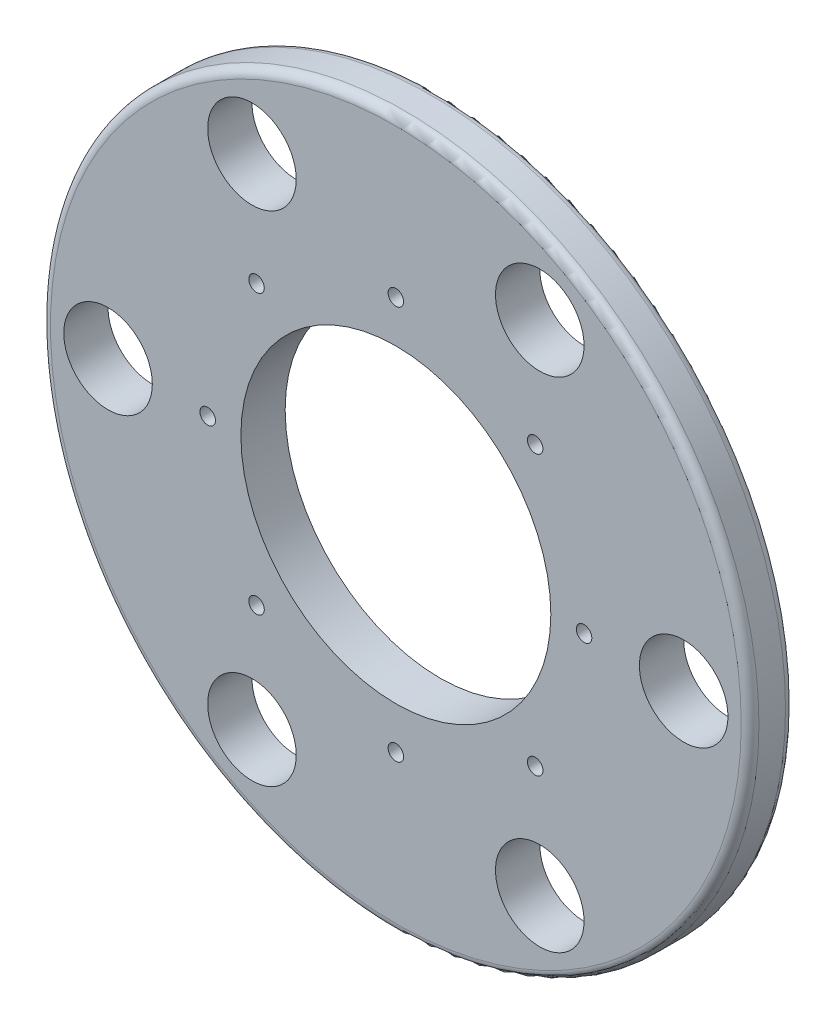
ISO-10303-21;
HEADER;
FILE_DESCRIPTION(('STEP AP214'),'2;1');
FILE_NAME('part.step','',(''),(''),'','','');
FILE_SCHEMA(('AUTOMOTIVE_DESIGN { 1 0 10303 214 1 1 1 1 }'));
ENDSEC;
DATA;
#1=APPLICATION_CONTEXT('core data for automotive mechanical design processes');
#2=APPLICATION_PROTOCOL_DEFINITION('international standard','automotive_design',2000,#1);
#3=PRODUCT_CONTEXT('',#1,'mechanical');
#4=PRODUCT('Part','Part','',(#3));
#5=PRODUCT_RELATED_PRODUCT_CATEGORY('part','',(#4));
#6=PRODUCT_DEFINITION_FORMATION('','',#4);
#7=PRODUCT_DEFINITION_CONTEXT('part definition',#1,'design');
#8=PRODUCT_DEFINITION('design','',#6,#7);
#9=PRODUCT_DEFINITION_SHAPE('','',#8);
#10=(LENGTH_UNIT() NAMED_UNIT(*) SI_UNIT(.MILLI.,.METRE.));
#11=(NAMED_UNIT(*) PLANE_ANGLE_UNIT() SI_UNIT($,.RADIAN.));
#12=(NAMED_UNIT(*) SI_UNIT($,.STERADIAN.) SOLID_ANGLE_UNIT());
#13=UNCERTAINTY_MEASURE_WITH_UNIT(LENGTH_MEASURE(1.E-05),#10,'distance_accuracy_value','');
#14=(GEOMETRIC_REPRESENTATION_CONTEXT(3) GLOBAL_UNCERTAINTY_ASSIGNED_CONTEXT((#13)) GLOBAL_UNIT_ASSIGNED_CONTEXT((#10,
#11,#12)) REPRESENTATION_CONTEXT('',''));
#15=CARTESIAN_POINT('',(0.,0.,0.));
#16=DIRECTION('',(0.,0.,1.));
#17=DIRECTION('',(1.,0.,0.));
#18=AXIS2_PLACEMENT_3D('',#15,#16,#17);
#19=CARTESIAN_POINT('',(0.,0.,-10.));
#20=DIRECTION('',(0.,0.,1.));
#21=DIRECTION('',(1.,0.,0.));
#22=AXIS2_PLACEMENT_3D('',#19,#20,#21);
#23=CYLINDRICAL_SURFACE('',#22,80.);
#24=CARTESIAN_POINT('',(0.,0.,-8.));
#25=DIRECTION('',(0.,0.,1.));
#26=DIRECTION('',(1.,0.,0.));
#27=AXIS2_PLACEMENT_3D('',#24,#25,#26);
#28=CIRCLE('',#27,80.);
#29=CARTESIAN_POINT('',(80.,0.,-8.));
#30=VERTEX_POINT('',#29);
#31=EDGE_CURVE('E53',#30,#30,#28,.T.);
#32=ORIENTED_EDGE('',*,*,#31,.T.);
#33=EDGE_LOOP('',(#32));
#34=FACE_BOUND('',#33,.T.);
#35=CARTESIAN_POINT('',(0.,0.,-2.));
#36=DIRECTION('',(0.,0.,1.));
#37=DIRECTION('',(1.,0.,0.));
#38=AXIS2_PLACEMENT_3D('',#35,#36,#37);
#39=CIRCLE('',#38,80.);
#40=CARTESIAN_POINT('',(80.,0.,-2.));
#41=VERTEX_POINT('',#40);
#42=EDGE_CURVE('E58',#41,#41,#39,.F.);
#43=ORIENTED_EDGE('',*,*,#42,.T.);
#44=EDGE_LOOP('',(#43));
#45=FACE_BOUND('',#44,.T.);
#46=ADVANCED_FACE('F40',(#34,#45),#23,.T.);
#47=CARTESIAN_POINT('',(0.,0.,-10.));
#48=DIRECTION('',(0.,0.,1.));
#49=DIRECTION('',(1.,0.,0.));
#50=AXIS2_PLACEMENT_3D('',#47,#48,#49);
#51=PLANE('',#50);
#52=CARTESIAN_POINT('',(0.,0.,-10.));
#53=DIRECTION('',(0.,0.,1.));
#54=DIRECTION('',(1.,0.,0.));
#55=AXIS2_PLACEMENT_3D('',#52,#53,#54);
#56=CIRCLE('',#55,78.);
#57=CARTESIAN_POINT('',(78.,0.,-10.));
#58=VERTEX_POINT('',#57);
#59=EDGE_CURVE('E48',#58,#58,#56,.F.);
#60=ORIENTED_EDGE('',*,*,#59,.T.);
#61=EDGE_LOOP('',(#60));
#62=FACE_BOUND('',#61,.T.);
#63=CARTESIAN_POINT('',(0.,0.,-10.));
#64=DIRECTION('',(0.,0.,1.));
#65=DIRECTION('',(1.,0.,0.));
#66=AXIS2_PLACEMENT_3D('',#63,#64,#65);
#67=CIRCLE('',#66,35.);
#68=CARTESIAN_POINT('',(35.,0.,-10.));
#69=VERTEX_POINT('',#68);
#70=EDGE_CURVE('E156',#69,#69,#67,.T.);
#71=ORIENTED_EDGE('',*,*,#70,.T.);
#72=EDGE_LOOP('',(#71));
#73=FACE_BOUND('',#72,.T.);
#74=CARTESIAN_POINT('',(1.55370919578519E-13,44.5,-10.));
#75=DIRECTION('',(0.,0.,1.));
#76=DIRECTION('',(1.,0.,0.));
#77=AXIS2_PLACEMENT_3D('',#74,#75,#76);
#78=CIRCLE('',#77,1.75);
#79=CARTESIAN_POINT('',(1.75000000000016,44.5,-10.));
#80=VERTEX_POINT('',#79);
#81=EDGE_CURVE('E82',#80,#80,#78,.T.);
#82=ORIENTED_EDGE('',*,*,#81,.T.);
#83=EDGE_LOOP('',(#82));
#84=FACE_BOUND('',#83,.T.);
#85=CARTESIAN_POINT('',(-4.66112758735558E-13,-44.5,-10.));
#86=DIRECTION('',(0.,0.,1.));
#87=DIRECTION('',(1.,0.,0.));
#88=AXIS2_PLACEMENT_3D('',#85,#86,#87);
#89=CIRCLE('',#88,1.75000000000001);
#90=CARTESIAN_POINT('',(1.74999999999954,-44.5,-10.));
#91=VERTEX_POINT('',#90);
#92=EDGE_CURVE('E151',#91,#91,#89,.T.);
#93=ORIENTED_EDGE('',*,*,#92,.T.);
#94=EDGE_LOOP('',(#93));
#95=FACE_BOUND('',#94,.T.);
#96=CARTESIAN_POINT('',(-31.4662517628013,31.4662517628014,-10.));
#97=DIRECTION('',(0.,0.,1.));
#98=DIRECTION('',(1.,0.,0.));
#99=AXIS2_PLACEMENT_3D('',#96,#97,#98);
#100=CIRCLE('',#99,1.75);
#101=CARTESIAN_POINT('',(-29.7162517628013,31.4662517628014,-10.));
#102=VERTEX_POINT('',#101);
#103=EDGE_CURVE('E160',#102,#102,#100,.T.);
#104=ORIENTED_EDGE('',*,*,#103,.T.);
#105=EDGE_LOOP('',(#104));
#106=FACE_BOUND('',#105,.T.);
#107=CARTESIAN_POINT('',(-42.5,0.,-10.));
#108=DIRECTION('',(0.,0.,1.));
#109=DIRECTION('',(1.,0.,0.));
#110=AXIS2_PLACEMENT_3D('',#107,#108,#109);
#111=CIRCLE('',#110,1.75);
#112=CARTESIAN_POINT('',(-40.75,0.,-10.));
#113=VERTEX_POINT('',#112);
#114=EDGE_CURVE('E168',#113,#113,#111,.T.);
#115=ORIENTED_EDGE('',*,*,#114,.T.);
#116=EDGE_LOOP('',(#115));
#117=FACE_BOUND('',#116,.T.);
#118=CARTESIAN_POINT('',(-31.4662517628018,-31.466251762801,-10.));
#119=DIRECTION('',(0.,0.,1.));
#120=DIRECTION('',(1.,0.,0.));
#121=AXIS2_PLACEMENT_3D('',#118,#119,#120);
#122=CIRCLE('',#121,1.75);
#123=CARTESIAN_POINT('',(-29.7162517628018,-31.466251762801,-10.));
#124=VERTEX_POINT('',#123);
#125=EDGE_CURVE('E117',#124,#124,#122,.T.);
#126=ORIENTED_EDGE('',*,*,#125,.T.);
#127=EDGE_LOOP('',(#126));
#128=FACE_BOUND('',#127,.T.);
#129=CARTESIAN_POINT('',(31.4662517628011,-31.4662517628016,-10.));
#130=DIRECTION('',(0.,0.,1.));
#131=DIRECTION('',(1.,0.,0.));
#132=AXIS2_PLACEMENT_3D('',#129,#130,#131);
#133=CIRCLE('',#132,1.75);
#134=CARTESIAN_POINT('',(33.2162517628011,-31.4662517628016,-10.));
#135=VERTEX_POINT('',#134);
#136=EDGE_CURVE('E126',#135,#135,#133,.T.);
#137=ORIENTED_EDGE('',*,*,#136,.T.);
#138=EDGE_LOOP('',(#137));
#139=FACE_BOUND('',#138,.T.);
#140=CARTESIAN_POINT('',(42.5,-2.9157116490529E-13,-10.));
#141=DIRECTION('',(0.,0.,1.));
#142=DIRECTION('',(1.,0.,0.));
#143=AXIS2_PLACEMENT_3D('',#140,#141,#142);
#144=CIRCLE('',#143,1.75);
#145=CARTESIAN_POINT('',(44.25,-2.9157116490529E-13,-10.));
#146=VERTEX_POINT('',#145);
#147=EDGE_CURVE('E134',#146,#146,#144,.T.);
#148=ORIENTED_EDGE('',*,*,#147,.T.);
#149=EDGE_LOOP('',(#148));
#150=FACE_BOUND('',#149,.T.);
#151=CARTESIAN_POINT('',(31.4662517628015,31.4662517628012,-10.));
#152=DIRECTION('',(0.,0.,1.));
#153=DIRECTION('',(1.,0.,0.));
#154=AXIS2_PLACEMENT_3D('',#151,#152,#153);
#155=CIRCLE('',#154,1.75);
#156=CARTESIAN_POINT('',(33.2162517628015,31.4662517628012,-10.));
#157=VERTEX_POINT('',#156);
#158=EDGE_CURVE('E142',#157,#157,#155,.T.);
#159=ORIENTED_EDGE('',*,*,#158,.T.);
#160=EDGE_LOOP('',(#159));
#161=FACE_BOUND('',#160,.T.);
#162=CARTESIAN_POINT('',(32.5000000000003,56.2916512459884,-10.));
#163=DIRECTION('',(0.,0.,1.));
#164=DIRECTION('',(1.,0.,0.));
#165=AXIS2_PLACEMENT_3D('',#162,#163,#164);
#166=CIRCLE('',#165,10.);
#167=CARTESIAN_POINT('',(42.5000000000003,56.2916512459884,-10.));
#168=VERTEX_POINT('',#167);
#169=EDGE_CURVE('E81',#168,#168,#166,.T.);
#170=ORIENTED_EDGE('',*,*,#169,.T.);
#171=EDGE_LOOP('',(#170));
#172=FACE_BOUND('',#171,.T.);
#173=CARTESIAN_POINT('',(65.,-4.45932369855149E-13,-10.));
#174=DIRECTION('',(0.,0.,1.));
#175=DIRECTION('',(1.,0.,0.));
#176=AXIS2_PLACEMENT_3D('',#173,#174,#175);
#177=CIRCLE('',#176,10.);
#178=CARTESIAN_POINT('',(75.,-4.45932369855149E-13,-10.));
#179=VERTEX_POINT('',#178);
#180=EDGE_CURVE('E90',#179,#179,#177,.T.);
#181=ORIENTED_EDGE('',*,*,#180,.T.);
#182=EDGE_LOOP('',(#181));
#183=FACE_BOUND('',#182,.T.);
#184=CARTESIAN_POINT('',(32.4999999999995,-56.2916512459888,-10.));
#185=DIRECTION('',(0.,0.,1.));
#186=DIRECTION('',(1.,0.,0.));
#187=AXIS2_PLACEMENT_3D('',#184,#185,#186);
#188=CIRCLE('',#187,10.);
#189=CARTESIAN_POINT('',(42.4999999999995,-56.2916512459888,-10.));
#190=VERTEX_POINT('',#189);
#191=EDGE_CURVE('E98',#190,#190,#188,.T.);
#192=ORIENTED_EDGE('',*,*,#191,.T.);
#193=EDGE_LOOP('',(#192));
#194=FACE_BOUND('',#193,.T.);
#195=CARTESIAN_POINT('',(-32.5000000000007,-56.2916512459882,-10.));
#196=DIRECTION('',(0.,0.,1.));
#197=DIRECTION('',(1.,0.,0.));
#198=AXIS2_PLACEMENT_3D('',#195,#196,#197);
#199=CIRCLE('',#198,10.);
#200=CARTESIAN_POINT('',(-22.5000000000006,-56.2916512459882,-10.));
#201=VERTEX_POINT('',#200);
#202=EDGE_CURVE('E106',#201,#201,#199,.T.);
#203=ORIENTED_EDGE('',*,*,#202,.T.);
#204=EDGE_LOOP('',(#203));
#205=FACE_BOUND('',#204,.T.);
#206=CARTESIAN_POINT('',(-65.,0.,-10.));
#207=DIRECTION('',(0.,0.,1.));
#208=DIRECTION('',(1.,0.,0.));
#209=AXIS2_PLACEMENT_3D('',#206,#207,#208);
#210=CIRCLE('',#209,10.);
#211=CARTESIAN_POINT('',(-55.,0.,-10.));
#212=VERTEX_POINT('',#211);
#213=EDGE_CURVE('E73',#212,#212,#210,.T.);
#214=ORIENTED_EDGE('',*,*,#213,.T.);
#215=EDGE_LOOP('',(#214));
#216=FACE_BOUND('',#215,.T.);
#217=CARTESIAN_POINT('',(-32.4999999999999,56.2916512459886,-10.));
#218=DIRECTION('',(0.,0.,1.));
#219=DIRECTION('',(1.,0.,0.));
#220=AXIS2_PLACEMENT_3D('',#217,#218,#219);
#221=CIRCLE('',#220,10.);
#222=CARTESIAN_POINT('',(-22.4999999999999,56.2916512459886,-10.));
#223=VERTEX_POINT('',#222);
#224=EDGE_CURVE('E68',#223,#223,#221,.T.);
#225=ORIENTED_EDGE('',*,*,#224,.T.);
#226=EDGE_LOOP('',(#225));
#227=FACE_BOUND('',#226,.T.);
#228=ADVANCED_FACE('F185',(#62,#73,#84,#95,#106,#117,#128,#139,#150,#161,#172,#183,#194,#205,
#216,#227),#51,.F.);
#229=CARTESIAN_POINT('',(0.,0.,0.));
#230=DIRECTION('',(0.,0.,1.));
#231=DIRECTION('',(1.,0.,0.));
#232=AXIS2_PLACEMENT_3D('',#229,#230,#231);
#233=PLANE('',#232);
#234=CARTESIAN_POINT('',(0.,0.,0.));
#235=DIRECTION('',(0.,0.,1.));
#236=DIRECTION('',(1.,0.,0.));
#237=AXIS2_PLACEMENT_3D('',#234,#235,#236);
#238=CIRCLE('',#237,78.);
#239=CARTESIAN_POINT('',(78.,0.,0.));
#240=VERTEX_POINT('',#239);
#241=EDGE_CURVE('E10',#240,#240,#238,.T.);
#242=ORIENTED_EDGE('',*,*,#241,.T.);
#243=EDGE_LOOP('',(#242));
#244=FACE_BOUND('',#243,.T.);
#245=CARTESIAN_POINT('',(1.55370919578519E-13,44.5,0.));
#246=DIRECTION('',(0.,0.,1.));
#247=DIRECTION('',(1.,0.,0.));
#248=AXIS2_PLACEMENT_3D('',#245,#246,#247);
#249=CIRCLE('',#248,1.75);
#250=CARTESIAN_POINT('',(1.75000000000016,44.5,0.));
#251=VERTEX_POINT('',#250);
#252=EDGE_CURVE('E150',#251,#251,#249,.T.);
#253=ORIENTED_EDGE('',*,*,#252,.F.);
#254=EDGE_LOOP('',(#253));
#255=FACE_BOUND('',#254,.T.);
#256=CARTESIAN_POINT('',(-4.66112758735558E-13,-44.5,0.));
#257=DIRECTION('',(0.,0.,1.));
#258=DIRECTION('',(1.,0.,0.));
#259=AXIS2_PLACEMENT_3D('',#256,#257,#258);
#260=CIRCLE('',#259,1.75000000000001);
#261=CARTESIAN_POINT('',(1.74999999999954,-44.5,0.));
#262=VERTEX_POINT('',#261);
#263=EDGE_CURVE('E155',#262,#262,#260,.T.);
#264=ORIENTED_EDGE('',*,*,#263,.F.);
#265=EDGE_LOOP('',(#264));
#266=FACE_BOUND('',#265,.T.);
#267=CARTESIAN_POINT('',(-31.4662517628013,31.4662517628014,0.));
#268=DIRECTION('',(0.,0.,1.));
#269=DIRECTION('',(1.,0.,0.));
#270=AXIS2_PLACEMENT_3D('',#267,#268,#269);
#271=CIRCLE('',#270,1.75);
#272=CARTESIAN_POINT('',(-29.7162517628013,31.4662517628014,0.));
#273=VERTEX_POINT('',#272);
#274=EDGE_CURVE('E164',#273,#273,#271,.T.);
#275=ORIENTED_EDGE('',*,*,#274,.F.);
#276=EDGE_LOOP('',(#275));
#277=FACE_BOUND('',#276,.T.);
#278=CARTESIAN_POINT('',(-42.5,0.,0.));
#279=DIRECTION('',(0.,0.,1.));
#280=DIRECTION('',(1.,0.,0.));
#281=AXIS2_PLACEMENT_3D('',#278,#279,#280);
#282=CIRCLE('',#281,1.75);
#283=CARTESIAN_POINT('',(-40.75,0.,0.));
#284=VERTEX_POINT('',#283);
#285=EDGE_CURVE('E122',#284,#284,#282,.T.);
#286=ORIENTED_EDGE('',*,*,#285,.F.);
#287=EDGE_LOOP('',(#286));
#288=FACE_BOUND('',#287,.T.);
#289=CARTESIAN_POINT('',(-31.4662517628018,-31.466251762801,0.));
#290=DIRECTION('',(0.,0.,1.));
#291=DIRECTION('',(1.,0.,0.));
#292=AXIS2_PLACEMENT_3D('',#289,#290,#291);
#293=CIRCLE('',#292,1.75);
#294=CARTESIAN_POINT('',(-29.7162517628018,-31.466251762801,0.));
#295=VERTEX_POINT('',#294);
#296=EDGE_CURVE('E121',#295,#295,#293,.T.);
#297=ORIENTED_EDGE('',*,*,#296,.F.);
#298=EDGE_LOOP('',(#297));
#299=FACE_BOUND('',#298,.T.);
#300=CARTESIAN_POINT('',(31.4662517628011,-31.4662517628016,0.));
#301=DIRECTION('',(0.,0.,1.));
#302=DIRECTION('',(1.,0.,0.));
#303=AXIS2_PLACEMENT_3D('',#300,#301,#302);
#304=CIRCLE('',#303,1.75);
#305=CARTESIAN_POINT('',(33.2162517628011,-31.4662517628016,0.));
#306=VERTEX_POINT('',#305);
#307=EDGE_CURVE('E130',#306,#306,#304,.T.);
#308=ORIENTED_EDGE('',*,*,#307,.F.);
#309=EDGE_LOOP('',(#308));
#310=FACE_BOUND('',#309,.T.);
#311=CARTESIAN_POINT('',(42.5,-2.9157116490529E-13,0.));
#312=DIRECTION('',(0.,0.,1.));
#313=DIRECTION('',(1.,0.,0.));
#314=AXIS2_PLACEMENT_3D('',#311,#312,#313);
#315=CIRCLE('',#314,1.75);
#316=CARTESIAN_POINT('',(44.25,-2.9157116490529E-13,0.));
#317=VERTEX_POINT('',#316);
#318=EDGE_CURVE('E138',#317,#317,#315,.T.);
#319=ORIENTED_EDGE('',*,*,#318,.F.);
#320=EDGE_LOOP('',(#319));
#321=FACE_BOUND('',#320,.T.);
#322=CARTESIAN_POINT('',(31.4662517628015,31.4662517628012,0.));
#323=DIRECTION('',(0.,0.,1.));
#324=DIRECTION('',(1.,0.,0.));
#325=AXIS2_PLACEMENT_3D('',#322,#323,#324);
#326=CIRCLE('',#325,1.75);
#327=CARTESIAN_POINT('',(33.2162517628015,31.4662517628012,0.));
#328=VERTEX_POINT('',#327);
#329=EDGE_CURVE('E146',#328,#328,#326,.T.);
#330=ORIENTED_EDGE('',*,*,#329,.F.);
#331=EDGE_LOOP('',(#330));
#332=FACE_BOUND('',#331,.T.);
#333=CARTESIAN_POINT('',(32.5000000000003,56.2916512459884,0.));
#334=DIRECTION('',(0.,0.,1.));
#335=DIRECTION('',(1.,0.,0.));
#336=AXIS2_PLACEMENT_3D('',#333,#334,#335);
#337=CIRCLE('',#336,10.);
#338=CARTESIAN_POINT('',(42.5000000000003,56.2916512459884,0.));
#339=VERTEX_POINT('',#338);
#340=EDGE_CURVE('E77',#339,#339,#337,.T.);
#341=ORIENTED_EDGE('',*,*,#340,.F.);
#342=EDGE_LOOP('',(#341));
#343=FACE_BOUND('',#342,.T.);
#344=CARTESIAN_POINT('',(65.,-4.45932369855149E-13,0.));
#345=DIRECTION('',(0.,0.,1.));
#346=DIRECTION('',(1.,0.,0.));
#347=AXIS2_PLACEMENT_3D('',#344,#345,#346);
#348=CIRCLE('',#347,10.);
#349=CARTESIAN_POINT('',(75.,-4.45932369855149E-13,0.));
#350=VERTEX_POINT('',#349);
#351=EDGE_CURVE('E86',#350,#350,#348,.T.);
#352=ORIENTED_EDGE('',*,*,#351,.F.);
#353=EDGE_LOOP('',(#352));
#354=FACE_BOUND('',#353,.T.);
#355=CARTESIAN_POINT('',(32.4999999999995,-56.2916512459888,0.));
#356=DIRECTION('',(0.,0.,1.));
#357=DIRECTION('',(1.,0.,0.));
#358=AXIS2_PLACEMENT_3D('',#355,#356,#357);
#359=CIRCLE('',#358,10.);
#360=CARTESIAN_POINT('',(42.4999999999995,-56.2916512459888,0.));
#361=VERTEX_POINT('',#360);
#362=EDGE_CURVE('E94',#361,#361,#359,.T.);
#363=ORIENTED_EDGE('',*,*,#362,.F.);
#364=EDGE_LOOP('',(#363));
#365=FACE_BOUND('',#364,.T.);
#366=CARTESIAN_POINT('',(-32.5000000000007,-56.2916512459882,0.));
#367=DIRECTION('',(0.,0.,1.));
#368=DIRECTION('',(1.,0.,0.));
#369=AXIS2_PLACEMENT_3D('',#366,#367,#368);
#370=CIRCLE('',#369,10.);
#371=CARTESIAN_POINT('',(-22.5000000000006,-56.2916512459882,0.));
#372=VERTEX_POINT('',#371);
#373=EDGE_CURVE('E102',#372,#372,#370,.T.);
#374=ORIENTED_EDGE('',*,*,#373,.F.);
#375=EDGE_LOOP('',(#374));
#376=FACE_BOUND('',#375,.T.);
#377=CARTESIAN_POINT('',(-65.,0.,0.));
#378=DIRECTION('',(0.,0.,1.));
#379=DIRECTION('',(1.,0.,0.));
#380=AXIS2_PLACEMENT_3D('',#377,#378,#379);
#381=CIRCLE('',#380,10.);
#382=CARTESIAN_POINT('',(-55.,0.,0.));
#383=VERTEX_POINT('',#382);
#384=EDGE_CURVE('E110',#383,#383,#381,.T.);
#385=ORIENTED_EDGE('',*,*,#384,.F.);
#386=EDGE_LOOP('',(#385));
#387=FACE_BOUND('',#386,.T.);
#388=CARTESIAN_POINT('',(-32.4999999999999,56.2916512459886,0.));
#389=DIRECTION('',(0.,0.,1.));
#390=DIRECTION('',(1.,0.,0.));
#391=AXIS2_PLACEMENT_3D('',#388,#389,#390);
#392=CIRCLE('',#391,10.);
#393=CARTESIAN_POINT('',(-22.4999999999999,56.2916512459886,0.));
#394=VERTEX_POINT('',#393);
#395=EDGE_CURVE('E69',#394,#394,#392,.T.);
#396=ORIENTED_EDGE('',*,*,#395,.F.);
#397=EDGE_LOOP('',(#396));
#398=FACE_BOUND('',#397,.T.);
#399=CARTESIAN_POINT('',(0.,0.,0.));
#400=DIRECTION('',(0.,0.,1.));
#401=DIRECTION('',(1.,0.,0.));
#402=AXIS2_PLACEMENT_3D('',#399,#400,#401);
#403=CIRCLE('',#402,35.);
#404=CARTESIAN_POINT('',(35.,0.,0.));
#405=VERTEX_POINT('',#404);
#406=EDGE_CURVE('E64',#405,#405,#403,.T.);
#407=ORIENTED_EDGE('',*,*,#406,.F.);
#408=EDGE_LOOP('',(#407));
#409=FACE_BOUND('',#408,.T.);
#410=ADVANCED_FACE('F191',(#244,#255,#266,#277,#288,#299,#310,#321,#332,#343,#354,#365,#376,
#387,#398,#409),#233,.T.);
#411=CARTESIAN_POINT('',(0.,0.,-7.));
#412=DIRECTION('',(0.,0.,1.));
#413=DIRECTION('',(1.,0.,0.));
#414=AXIS2_PLACEMENT_3D('',#411,#412,#413);
#415=CYLINDRICAL_SURFACE('',#414,35.);
#416=ORIENTED_EDGE('',*,*,#406,.T.);
#417=EDGE_LOOP('',(#416));
#418=FACE_BOUND('',#417,.T.);
#419=ORIENTED_EDGE('',*,*,#70,.F.);
#420=EDGE_LOOP('',(#419));
#421=FACE_BOUND('',#420,.T.);
#422=ADVANCED_FACE('F188',(#418,#421),#415,.F.);
#423=CARTESIAN_POINT('',(-32.4999999999999,56.2916512459886,-10.));
#424=DIRECTION('',(0.,0.,1.));
#425=DIRECTION('',(1.,0.,0.));
#426=AXIS2_PLACEMENT_3D('',#423,#424,#425);
#427=CYLINDRICAL_SURFACE('',#426,10.);
#428=ORIENTED_EDGE('',*,*,#224,.F.);
#429=EDGE_LOOP('',(#428));
#430=FACE_BOUND('',#429,.T.);
#431=ORIENTED_EDGE('',*,*,#395,.T.);
#432=EDGE_LOOP('',(#431));
#433=FACE_BOUND('',#432,.T.);
#434=ADVANCED_FACE('F190',(#430,#433),#427,.F.);
#435=CARTESIAN_POINT('',(-65.,0.,-10.));
#436=DIRECTION('',(0.,0.,1.));
#437=DIRECTION('',(1.,0.,0.));
#438=AXIS2_PLACEMENT_3D('',#435,#436,#437);
#439=CYLINDRICAL_SURFACE('',#438,10.);
#440=ORIENTED_EDGE('',*,*,#213,.F.);
#441=EDGE_LOOP('',(#440));
#442=FACE_BOUND('',#441,.T.);
#443=ORIENTED_EDGE('',*,*,#384,.T.);
#444=EDGE_LOOP('',(#443));
#445=FACE_BOUND('',#444,.T.);
#446=ADVANCED_FACE('F198',(#442,#445),#439,.F.);
#447=CARTESIAN_POINT('',(-32.5000000000007,-56.2916512459882,-10.));
#448=DIRECTION('',(0.,0.,1.));
#449=DIRECTION('',(1.,0.,0.));
#450=AXIS2_PLACEMENT_3D('',#447,#448,#449);
#451=CYLINDRICAL_SURFACE('',#450,10.);
#452=ORIENTED_EDGE('',*,*,#202,.F.);
#453=EDGE_LOOP('',(#452));
#454=FACE_BOUND('',#453,.T.);
#455=ORIENTED_EDGE('',*,*,#373,.T.);
#456=EDGE_LOOP('',(#455));
#457=FACE_BOUND('',#456,.T.);
#458=ADVANCED_FACE('F260',(#454,#457),#451,.F.);
#459=CARTESIAN_POINT('',(32.4999999999995,-56.2916512459888,-10.));
#460=DIRECTION('',(0.,0.,1.));
#461=DIRECTION('',(1.,0.,0.));
#462=AXIS2_PLACEMENT_3D('',#459,#460,#461);
#463=CYLINDRICAL_SURFACE('',#462,10.);
#464=ORIENTED_EDGE('',*,*,#191,.F.);
#465=EDGE_LOOP('',(#464));
#466=FACE_BOUND('',#465,.T.);
#467=ORIENTED_EDGE('',*,*,#362,.T.);
#468=EDGE_LOOP('',(#467));
#469=FACE_BOUND('',#468,.T.);
#470=ADVANCED_FACE('F264',(#466,#469),#463,.F.);
#471=CARTESIAN_POINT('',(65.,-4.45932369855149E-13,-10.));
#472=DIRECTION('',(0.,0.,1.));
#473=DIRECTION('',(1.,0.,0.));
#474=AXIS2_PLACEMENT_3D('',#471,#472,#473);
#475=CYLINDRICAL_SURFACE('',#474,10.);
#476=ORIENTED_EDGE('',*,*,#180,.F.);
#477=EDGE_LOOP('',(#476));
#478=FACE_BOUND('',#477,.T.);
#479=ORIENTED_EDGE('',*,*,#351,.T.);
#480=EDGE_LOOP('',(#479));
#481=FACE_BOUND('',#480,.T.);
#482=ADVANCED_FACE('F268',(#478,#481),#475,.F.);
#483=CARTESIAN_POINT('',(32.5000000000003,56.2916512459884,-10.));
#484=DIRECTION('',(0.,0.,1.));
#485=DIRECTION('',(1.,0.,0.));
#486=AXIS2_PLACEMENT_3D('',#483,#484,#485);
#487=CYLINDRICAL_SURFACE('',#486,10.);
#488=ORIENTED_EDGE('',*,*,#169,.F.);
#489=EDGE_LOOP('',(#488));
#490=FACE_BOUND('',#489,.T.);
#491=ORIENTED_EDGE('',*,*,#340,.T.);
#492=EDGE_LOOP('',(#491));
#493=FACE_BOUND('',#492,.T.);
#494=ADVANCED_FACE('F246',(#490,#493),#487,.F.);
#495=CARTESIAN_POINT('',(31.4662517628015,31.4662517628012,-10.));
#496=DIRECTION('',(0.,0.,1.));
#497=DIRECTION('',(1.,0.,0.));
#498=AXIS2_PLACEMENT_3D('',#495,#496,#497);
#499=CYLINDRICAL_SURFACE('',#498,1.75);
#500=ORIENTED_EDGE('',*,*,#158,.F.);
#501=EDGE_LOOP('',(#500));
#502=FACE_BOUND('',#501,.T.);
#503=ORIENTED_EDGE('',*,*,#329,.T.);
#504=EDGE_LOOP('',(#503));
#505=FACE_BOUND('',#504,.T.);
#506=ADVANCED_FACE('F242',(#502,#505),#499,.F.);
#507=CARTESIAN_POINT('',(42.5,-2.9157116490529E-13,-10.));
#508=DIRECTION('',(0.,0.,1.));
#509=DIRECTION('',(1.,0.,0.));
#510=AXIS2_PLACEMENT_3D('',#507,#508,#509);
#511=CYLINDRICAL_SURFACE('',#510,1.75);
#512=ORIENTED_EDGE('',*,*,#147,.F.);
#513=EDGE_LOOP('',(#512));
#514=FACE_BOUND('',#513,.T.);
#515=ORIENTED_EDGE('',*,*,#318,.T.);
#516=EDGE_LOOP('',(#515));
#517=FACE_BOUND('',#516,.T.);
#518=ADVANCED_FACE('F245',(#514,#517),#511,.F.);
#519=CARTESIAN_POINT('',(31.4662517628011,-31.4662517628016,-10.));
#520=DIRECTION('',(0.,0.,1.));
#521=DIRECTION('',(1.,0.,0.));
#522=AXIS2_PLACEMENT_3D('',#519,#520,#521);
#523=CYLINDRICAL_SURFACE('',#522,1.75);
#524=ORIENTED_EDGE('',*,*,#136,.F.);
#525=EDGE_LOOP('',(#524));
#526=FACE_BOUND('',#525,.T.);
#527=ORIENTED_EDGE('',*,*,#307,.T.);
#528=EDGE_LOOP('',(#527));
#529=FACE_BOUND('',#528,.T.);
#530=ADVANCED_FACE('F250',(#526,#529),#523,.F.);
#531=CARTESIAN_POINT('',(-31.4662517628018,-31.466251762801,-10.));
#532=DIRECTION('',(0.,0.,1.));
#533=DIRECTION('',(1.,0.,0.));
#534=AXIS2_PLACEMENT_3D('',#531,#532,#533);
#535=CYLINDRICAL_SURFACE('',#534,1.75);
#536=ORIENTED_EDGE('',*,*,#125,.F.);
#537=EDGE_LOOP('',(#536));
#538=FACE_BOUND('',#537,.T.);
#539=ORIENTED_EDGE('',*,*,#296,.T.);
#540=EDGE_LOOP('',(#539));
#541=FACE_BOUND('',#540,.T.);
#542=ADVANCED_FACE('F237',(#538,#541),#535,.F.);
#543=CARTESIAN_POINT('',(-42.5,0.,-10.));
#544=DIRECTION('',(0.,0.,1.));
#545=DIRECTION('',(1.,0.,0.));
#546=AXIS2_PLACEMENT_3D('',#543,#544,#545);
#547=CYLINDRICAL_SURFACE('',#546,1.75);
#548=ORIENTED_EDGE('',*,*,#114,.F.);
#549=EDGE_LOOP('',(#548));
#550=FACE_BOUND('',#549,.T.);
#551=ORIENTED_EDGE('',*,*,#285,.T.);
#552=EDGE_LOOP('',(#551));
#553=FACE_BOUND('',#552,.T.);
#554=ADVANCED_FACE('F234',(#550,#553),#547,.F.);
#555=CARTESIAN_POINT('',(-31.4662517628013,31.4662517628014,-10.));
#556=DIRECTION('',(0.,0.,1.));
#557=DIRECTION('',(1.,0.,0.));
#558=AXIS2_PLACEMENT_3D('',#555,#556,#557);
#559=CYLINDRICAL_SURFACE('',#558,1.75);
#560=ORIENTED_EDGE('',*,*,#103,.F.);
#561=EDGE_LOOP('',(#560));
#562=FACE_BOUND('',#561,.T.);
#563=ORIENTED_EDGE('',*,*,#274,.T.);
#564=EDGE_LOOP('',(#563));
#565=FACE_BOUND('',#564,.T.);
#566=ADVANCED_FACE('F228',(#562,#565),#559,.F.);
#567=CARTESIAN_POINT('',(-4.66112758735558E-13,-44.5,-10.));
#568=DIRECTION('',(0.,0.,1.));
#569=DIRECTION('',(1.,0.,0.));
#570=AXIS2_PLACEMENT_3D('',#567,#568,#569);
#571=CYLINDRICAL_SURFACE('',#570,1.75000000000001);
#572=ORIENTED_EDGE('',*,*,#92,.F.);
#573=EDGE_LOOP('',(#572));
#574=FACE_BOUND('',#573,.T.);
#575=ORIENTED_EDGE('',*,*,#263,.T.);
#576=EDGE_LOOP('',(#575));
#577=FACE_BOUND('',#576,.T.);
#578=ADVANCED_FACE('F220',(#574,#577),#571,.F.);
#579=CARTESIAN_POINT('',(1.55370919578519E-13,44.5,-10.));
#580=DIRECTION('',(0.,0.,1.));
#581=DIRECTION('',(1.,0.,0.));
#582=AXIS2_PLACEMENT_3D('',#579,#580,#581);
#583=CYLINDRICAL_SURFACE('',#582,1.75);
#584=ORIENTED_EDGE('',*,*,#81,.F.);
#585=EDGE_LOOP('',(#584));
#586=FACE_BOUND('',#585,.T.);
#587=ORIENTED_EDGE('',*,*,#252,.T.);
#588=EDGE_LOOP('',(#587));
#589=FACE_BOUND('',#588,.T.);
#590=ADVANCED_FACE('F213',(#586,#589),#583,.F.);
#591=CARTESIAN_POINT('',(0.,0.,-8.));
#592=DIRECTION('',(0.,0.,1.));
#593=DIRECTION('',(1.,0.,0.));
#594=AXIS2_PLACEMENT_3D('',#591,#592,#593);
#595=TOROIDAL_SURFACE('',#594,78.,2.);
#596=ORIENTED_EDGE('',*,*,#59,.F.);
#597=EDGE_LOOP('',(#596));
#598=FACE_BOUND('',#597,.T.);
#599=ORIENTED_EDGE('',*,*,#31,.F.);
#600=EDGE_LOOP('',(#599));
#601=FACE_BOUND('',#600,.T.);
#602=ADVANCED_FACE('F211',(#598,#601),#595,.T.);
#603=CARTESIAN_POINT('',(0.,0.,-2.));
#604=DIRECTION('',(0.,0.,1.));
#605=DIRECTION('',(1.,0.,0.));
#606=AXIS2_PLACEMENT_3D('',#603,#604,#605);
#607=TOROIDAL_SURFACE('',#606,78.,2.);
#608=ORIENTED_EDGE('',*,*,#42,.F.);
#609=EDGE_LOOP('',(#608));
#610=FACE_BOUND('',#609,.T.);
#611=ORIENTED_EDGE('',*,*,#241,.F.);
#612=EDGE_LOOP('',(#611));
#613=FACE_BOUND('',#612,.T.);
#614=ADVANCED_FACE('F42',(#610,#613),#607,.T.);
#615=CLOSED_SHELL('',(#46,#228,#410,#422,#434,#446,#458,#470,#482,#494,#506,#518,#530,#542,#554,
#566,#578,#590,#602,#614));
#616=MANIFOLD_SOLID_BREP('B2',#615);
#617=ADVANCED_BREP_SHAPE_REPRESENTATION('',(#18,#616),#14);
#618=SHAPE_DEFINITION_REPRESENTATION(#9,#617);
ENDSEC;
END-ISO-10303-21;
